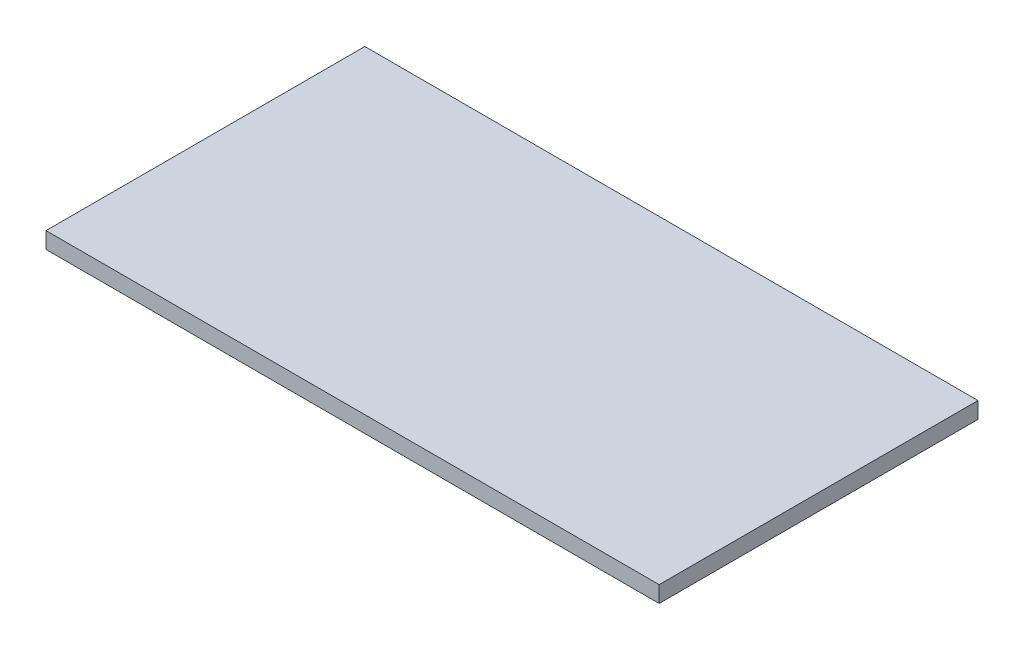
ISO-10303-21;
HEADER;
FILE_DESCRIPTION(('STEP AP214'),'2;1');
FILE_NAME('part.step','',(''),(''),'','','');
FILE_SCHEMA(('AUTOMOTIVE_DESIGN { 1 0 10303 214 1 1 1 1 }'));
ENDSEC;
DATA;
#1=APPLICATION_CONTEXT('core data for automotive mechanical design processes');
#2=APPLICATION_PROTOCOL_DEFINITION('international standard','automotive_design',2000,#1);
#3=PRODUCT_CONTEXT('',#1,'mechanical');
#4=PRODUCT('Part','Part','',(#3));
#5=PRODUCT_RELATED_PRODUCT_CATEGORY('part','',(#4));
#6=PRODUCT_DEFINITION_FORMATION('','',#4);
#7=PRODUCT_DEFINITION_CONTEXT('part definition',#1,'design');
#8=PRODUCT_DEFINITION('design','',#6,#7);
#9=PRODUCT_DEFINITION_SHAPE('','',#8);
#10=(LENGTH_UNIT() NAMED_UNIT(*) SI_UNIT(.MILLI.,.METRE.));
#11=(NAMED_UNIT(*) PLANE_ANGLE_UNIT() SI_UNIT($,.RADIAN.));
#12=(NAMED_UNIT(*) SI_UNIT($,.STERADIAN.) SOLID_ANGLE_UNIT());
#13=UNCERTAINTY_MEASURE_WITH_UNIT(LENGTH_MEASURE(1.E-05),#10,'distance_accuracy_value','');
#14=(GEOMETRIC_REPRESENTATION_CONTEXT(3) GLOBAL_UNCERTAINTY_ASSIGNED_CONTEXT((#13)) GLOBAL_UNIT_ASSIGNED_CONTEXT((#10,
#11,#12)) REPRESENTATION_CONTEXT('',''));
#15=CARTESIAN_POINT('',(0.,0.,0.));
#16=DIRECTION('',(0.,0.,1.));
#17=DIRECTION('',(1.,0.,0.));
#18=AXIS2_PLACEMENT_3D('',#15,#16,#17);
#19=CARTESIAN_POINT('',(0.,0.,0.));
#20=DIRECTION('',(0.,-1.,0.));
#21=DIRECTION('',(0.,0.,-1.));
#22=AXIS2_PLACEMENT_3D('',#19,#20,#21);
#23=PLANE('',#22);
#24=DIRECTION('',(0.,0.,-1.));
#25=VECTOR('',#24,1.);
#26=CARTESIAN_POINT('',(-150.,0.,78.));
#27=LINE('',#26,#25);
#28=CARTESIAN_POINT('',(-150.,0.,78.));
#29=VERTEX_POINT('',#28);
#30=CARTESIAN_POINT('',(-150.,0.,-78.));
#31=VERTEX_POINT('',#30);
#32=EDGE_CURVE('E55',#29,#31,#27,.T.);
#33=ORIENTED_EDGE('',*,*,#32,.T.);
#34=DIRECTION('',(1.,0.,0.));
#35=VECTOR('',#34,1.);
#36=CARTESIAN_POINT('',(-150.,0.,-78.));
#37=LINE('',#36,#35);
#38=CARTESIAN_POINT('',(150.,0.,-78.));
#39=VERTEX_POINT('',#38);
#40=EDGE_CURVE('E76',#31,#39,#37,.T.);
#41=ORIENTED_EDGE('',*,*,#40,.T.);
#42=DIRECTION('',(0.,0.,1.));
#43=VECTOR('',#42,1.);
#44=CARTESIAN_POINT('',(150.,0.,78.));
#45=LINE('',#44,#43);
#46=CARTESIAN_POINT('',(150.,0.,78.));
#47=VERTEX_POINT('',#46);
#48=EDGE_CURVE('E58',#39,#47,#45,.T.);
#49=ORIENTED_EDGE('',*,*,#48,.T.);
#50=DIRECTION('',(-1.,0.,0.));
#51=VECTOR('',#50,1.);
#52=CARTESIAN_POINT('',(-150.,0.,78.));
#53=LINE('',#52,#51);
#54=EDGE_CURVE('E20',#47,#29,#53,.T.);
#55=ORIENTED_EDGE('',*,*,#54,.T.);
#56=EDGE_LOOP('',(#33,#41,#49,#55));
#57=FACE_BOUND('',#56,.T.);
#58=ADVANCED_FACE('F17',(#57),#23,.T.);
#59=CARTESIAN_POINT('',(-150.,8.,78.));
#60=DIRECTION('',(0.,0.,-1.));
#61=DIRECTION('',(-1.,0.,0.));
#62=AXIS2_PLACEMENT_3D('',#59,#60,#61);
#63=PLANE('',#62);
#64=DIRECTION('',(0.,1.,0.));
#65=VECTOR('',#64,1.);
#66=CARTESIAN_POINT('',(150.,8.,78.));
#67=LINE('',#66,#65);
#68=CARTESIAN_POINT('',(150.,8.,78.));
#69=VERTEX_POINT('',#68);
#70=EDGE_CURVE('E78',#47,#69,#67,.T.);
#71=ORIENTED_EDGE('',*,*,#70,.T.);
#72=DIRECTION('',(1.,0.,0.));
#73=VECTOR('',#72,1.);
#74=CARTESIAN_POINT('',(0.,8.,78.));
#75=LINE('',#74,#73);
#76=CARTESIAN_POINT('',(-150.,8.,78.));
#77=VERTEX_POINT('',#76);
#78=EDGE_CURVE('E73',#69,#77,#75,.F.);
#79=ORIENTED_EDGE('',*,*,#78,.T.);
#80=DIRECTION('',(0.,1.,0.));
#81=VECTOR('',#80,1.);
#82=CARTESIAN_POINT('',(-150.,8.,78.));
#83=LINE('',#82,#81);
#84=EDGE_CURVE('E63',#77,#29,#83,.F.);
#85=ORIENTED_EDGE('',*,*,#84,.T.);
#86=ORIENTED_EDGE('',*,*,#54,.F.);
#87=EDGE_LOOP('',(#71,#79,#85,#86));
#88=FACE_BOUND('',#87,.T.);
#89=ADVANCED_FACE('F72',(#88),#63,.F.);
#90=CARTESIAN_POINT('',(-150.,8.,78.));
#91=DIRECTION('',(1.,0.,0.));
#92=DIRECTION('',(0.,0.,-1.));
#93=AXIS2_PLACEMENT_3D('',#90,#91,#92);
#94=PLANE('',#93);
#95=ORIENTED_EDGE('',*,*,#84,.F.);
#96=DIRECTION('',(0.,0.,-1.));
#97=VECTOR('',#96,1.);
#98=CARTESIAN_POINT('',(-150.,8.,0.));
#99=LINE('',#98,#97);
#100=CARTESIAN_POINT('',(-150.,8.,-78.));
#101=VERTEX_POINT('',#100);
#102=EDGE_CURVE('E83',#77,#101,#99,.T.);
#103=ORIENTED_EDGE('',*,*,#102,.T.);
#104=DIRECTION('',(0.,1.,0.));
#105=VECTOR('',#104,1.);
#106=CARTESIAN_POINT('',(-150.,8.,-78.));
#107=LINE('',#106,#105);
#108=EDGE_CURVE('E69',#101,#31,#107,.F.);
#109=ORIENTED_EDGE('',*,*,#108,.T.);
#110=ORIENTED_EDGE('',*,*,#32,.F.);
#111=EDGE_LOOP('',(#95,#103,#109,#110));
#112=FACE_BOUND('',#111,.T.);
#113=ADVANCED_FACE('F66',(#112),#94,.F.);
#114=CARTESIAN_POINT('',(-150.,8.,-78.));
#115=DIRECTION('',(0.,0.,1.));
#116=DIRECTION('',(1.,0.,0.));
#117=AXIS2_PLACEMENT_3D('',#114,#115,#116);
#118=PLANE('',#117);
#119=ORIENTED_EDGE('',*,*,#108,.F.);
#120=DIRECTION('',(1.,0.,0.));
#121=VECTOR('',#120,1.);
#122=CARTESIAN_POINT('',(0.,8.,-78.));
#123=LINE('',#122,#121);
#124=CARTESIAN_POINT('',(150.,8.,-78.));
#125=VERTEX_POINT('',#124);
#126=EDGE_CURVE('E26',#101,#125,#123,.T.);
#127=ORIENTED_EDGE('',*,*,#126,.T.);
#128=DIRECTION('',(0.,1.,0.));
#129=VECTOR('',#128,1.);
#130=CARTESIAN_POINT('',(150.,8.,-78.));
#131=LINE('',#130,#129);
#132=EDGE_CURVE('E34',#125,#39,#131,.F.);
#133=ORIENTED_EDGE('',*,*,#132,.T.);
#134=ORIENTED_EDGE('',*,*,#40,.F.);
#135=EDGE_LOOP('',(#119,#127,#133,#134));
#136=FACE_BOUND('',#135,.T.);
#137=ADVANCED_FACE('F88',(#136),#118,.F.);
#138=CARTESIAN_POINT('',(150.,8.,78.));
#139=DIRECTION('',(-1.,0.,0.));
#140=DIRECTION('',(0.,0.,1.));
#141=AXIS2_PLACEMENT_3D('',#138,#139,#140);
#142=PLANE('',#141);
#143=ORIENTED_EDGE('',*,*,#132,.F.);
#144=DIRECTION('',(0.,0.,-1.));
#145=VECTOR('',#144,1.);
#146=CARTESIAN_POINT('',(150.,8.,0.));
#147=LINE('',#146,#145);
#148=EDGE_CURVE('E11',#125,#69,#147,.F.);
#149=ORIENTED_EDGE('',*,*,#148,.T.);
#150=ORIENTED_EDGE('',*,*,#70,.F.);
#151=ORIENTED_EDGE('',*,*,#48,.F.);
#152=EDGE_LOOP('',(#143,#149,#150,#151));
#153=FACE_BOUND('',#152,.T.);
#154=ADVANCED_FACE('F91',(#153),#142,.F.);
#155=CARTESIAN_POINT('',(0.,8.,0.));
#156=DIRECTION('',(0.,-1.,0.));
#157=DIRECTION('',(0.,0.,-1.));
#158=AXIS2_PLACEMENT_3D('',#155,#156,#157);
#159=PLANE('',#158);
#160=ORIENTED_EDGE('',*,*,#126,.F.);
#161=ORIENTED_EDGE('',*,*,#102,.F.);
#162=ORIENTED_EDGE('',*,*,#78,.F.);
#163=ORIENTED_EDGE('',*,*,#148,.F.);
#164=EDGE_LOOP('',(#160,#161,#162,#163));
#165=FACE_BOUND('',#164,.T.);
#166=ADVANCED_FACE('F90',(#165),#159,.F.);
#167=CLOSED_SHELL('',(#58,#89,#113,#137,#154,#166));
#168=MANIFOLD_SOLID_BREP('B1',#167);
#169=ADVANCED_BREP_SHAPE_REPRESENTATION('',(#18,#168),#14);
#170=SHAPE_DEFINITION_REPRESENTATION(#9,#169);
ENDSEC;
END-ISO-10303-21;
